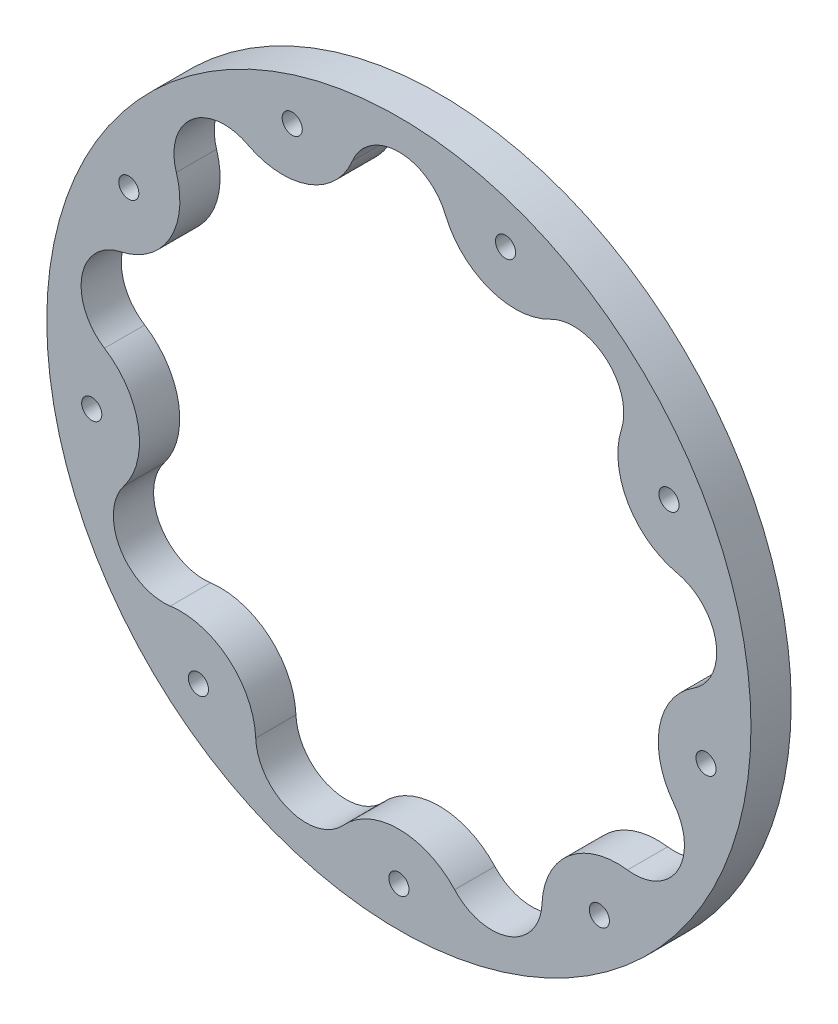
ISO-10303-21;
HEADER;
FILE_DESCRIPTION(('STEP AP214'),'2;1');
FILE_NAME('part.step','',(''),(''),'','','');
FILE_SCHEMA(('AUTOMOTIVE_DESIGN { 1 0 10303 214 1 1 1 1 }'));
ENDSEC;
DATA;
#1=APPLICATION_CONTEXT('core data for automotive mechanical design processes');
#2=APPLICATION_PROTOCOL_DEFINITION('international standard','automotive_design',2000,#1);
#3=PRODUCT_CONTEXT('',#1,'mechanical');
#4=PRODUCT('Part','Part','',(#3));
#5=PRODUCT_RELATED_PRODUCT_CATEGORY('part','',(#4));
#6=PRODUCT_DEFINITION_FORMATION('','',#4);
#7=PRODUCT_DEFINITION_CONTEXT('part definition',#1,'design');
#8=PRODUCT_DEFINITION('design','',#6,#7);
#9=PRODUCT_DEFINITION_SHAPE('','',#8);
#10=(LENGTH_UNIT() NAMED_UNIT(*) SI_UNIT(.MILLI.,.METRE.));
#11=(NAMED_UNIT(*) PLANE_ANGLE_UNIT() SI_UNIT($,.RADIAN.));
#12=(NAMED_UNIT(*) SI_UNIT($,.STERADIAN.) SOLID_ANGLE_UNIT());
#13=UNCERTAINTY_MEASURE_WITH_UNIT(LENGTH_MEASURE(1.E-05),#10,'distance_accuracy_value','');
#14=(GEOMETRIC_REPRESENTATION_CONTEXT(3) GLOBAL_UNCERTAINTY_ASSIGNED_CONTEXT((#13)) GLOBAL_UNIT_ASSIGNED_CONTEXT((#10,
#11,#12)) REPRESENTATION_CONTEXT('',''));
#15=CARTESIAN_POINT('',(0.,0.,0.));
#16=DIRECTION('',(0.,0.,1.));
#17=DIRECTION('',(1.,0.,0.));
#18=AXIS2_PLACEMENT_3D('',#15,#16,#17);
#19=CARTESIAN_POINT('',(0.,0.,8.));
#20=DIRECTION('',(0.,0.,-1.));
#21=DIRECTION('',(-1.,0.,0.));
#22=AXIS2_PLACEMENT_3D('',#19,#20,#21);
#23=CYLINDRICAL_SURFACE('',#22,70.);
#24=CARTESIAN_POINT('',(0.,0.,8.));
#25=DIRECTION('',(0.,0.,1.));
#26=DIRECTION('',(1.,0.,0.));
#27=AXIS2_PLACEMENT_3D('',#24,#25,#26);
#28=CIRCLE('',#27,70.);
#29=CARTESIAN_POINT('',(70.,0.,8.));
#30=VERTEX_POINT('',#29);
#31=EDGE_CURVE('E11',#30,#30,#28,.T.);
#32=ORIENTED_EDGE('',*,*,#31,.F.);
#33=EDGE_LOOP('',(#32));
#34=FACE_BOUND('',#33,.T.);
#35=CARTESIAN_POINT('',(0.,0.,0.));
#36=DIRECTION('',(0.,0.,1.));
#37=DIRECTION('',(1.,0.,0.));
#38=AXIS2_PLACEMENT_3D('',#35,#36,#37);
#39=CIRCLE('',#38,70.);
#40=CARTESIAN_POINT('',(70.,0.,0.));
#41=VERTEX_POINT('',#40);
#42=EDGE_CURVE('E44',#41,#41,#39,.T.);
#43=ORIENTED_EDGE('',*,*,#42,.T.);
#44=EDGE_LOOP('',(#43));
#45=FACE_BOUND('',#44,.T.);
#46=ADVANCED_FACE('F41',(#34,#45),#23,.T.);
#47=CARTESIAN_POINT('',(0.,0.,8.));
#48=DIRECTION('',(0.,0.,1.));
#49=DIRECTION('',(1.,0.,0.));
#50=AXIS2_PLACEMENT_3D('',#47,#48,#49);
#51=PLANE('',#50);
#52=CARTESIAN_POINT('',(21.2052488861907,58.2609424887266,8.));
#53=DIRECTION('',(0.,0.,-1.));
#54=DIRECTION('',(-1.,0.,0.));
#55=AXIS2_PLACEMENT_3D('',#52,#53,#54);
#56=CIRCLE('',#55,1.99999999999999);
#57=CARTESIAN_POINT('',(19.2052488861907,58.2609424887266,8.));
#58=VERTEX_POINT('',#57);
#59=EDGE_CURVE('E647',#58,#58,#56,.T.);
#60=ORIENTED_EDGE('',*,*,#59,.T.);
#61=EDGE_LOOP('',(#60));
#62=FACE_BOUND('',#61,.T.);
#63=CARTESIAN_POINT('',(53.6935750346349,31.0000000000006,8.));
#64=DIRECTION('',(0.,0.,-1.));
#65=DIRECTION('',(-1.,0.,0.));
#66=AXIS2_PLACEMENT_3D('',#63,#64,#65);
#67=CIRCLE('',#66,2.);
#68=CARTESIAN_POINT('',(51.6935750346349,31.0000000000006,8.));
#69=VERTEX_POINT('',#68);
#70=EDGE_CURVE('E650',#69,#69,#67,.T.);
#71=ORIENTED_EDGE('',*,*,#70,.T.);
#72=EDGE_LOOP('',(#71));
#73=FACE_BOUND('',#72,.T.);
#74=CARTESIAN_POINT('',(61.058080686757,-10.7661870153491,8.));
#75=DIRECTION('',(0.,0.,-1.));
#76=DIRECTION('',(-1.,0.,0.));
#77=AXIS2_PLACEMENT_3D('',#74,#75,#76);
#78=CIRCLE('',#77,2.00000000000001);
#79=CARTESIAN_POINT('',(59.058080686757,-10.7661870153491,8.));
#80=VERTEX_POINT('',#79);
#81=EDGE_CURVE('E699',#80,#80,#78,.T.);
#82=ORIENTED_EDGE('',*,*,#81,.T.);
#83=EDGE_LOOP('',(#82));
#84=FACE_BOUND('',#83,.T.);
#85=CARTESIAN_POINT('',(39.8528318005658,-47.4947554733763,8.));
#86=DIRECTION('',(0.,0.,-1.));
#87=DIRECTION('',(-1.,0.,0.));
#88=AXIS2_PLACEMENT_3D('',#85,#86,#87);
#89=CIRCLE('',#88,2.);
#90=CARTESIAN_POINT('',(37.8528318005658,-47.4947554733763,8.));
#91=VERTEX_POINT('',#90);
#92=EDGE_CURVE('E693',#91,#91,#89,.T.);
#93=ORIENTED_EDGE('',*,*,#92,.T.);
#94=EDGE_LOOP('',(#93));
#95=FACE_BOUND('',#94,.T.);
#96=CARTESIAN_POINT('',(4.26741975090295E-13,-62.,8.));
#97=DIRECTION('',(0.,0.,-1.));
#98=DIRECTION('',(-1.,0.,0.));
#99=AXIS2_PLACEMENT_3D('',#96,#97,#98);
#100=CIRCLE('',#99,2.);
#101=CARTESIAN_POINT('',(-1.99999999999958,-62.,8.));
#102=VERTEX_POINT('',#101);
#103=EDGE_CURVE('E687',#102,#102,#100,.T.);
#104=ORIENTED_EDGE('',*,*,#103,.T.);
#105=EDGE_LOOP('',(#104));
#106=FACE_BOUND('',#105,.T.);
#107=CARTESIAN_POINT('',(-39.8528318005652,-47.4947554733769,8.));
#108=DIRECTION('',(0.,0.,-1.));
#109=DIRECTION('',(-1.,0.,0.));
#110=AXIS2_PLACEMENT_3D('',#107,#108,#109);
#111=CIRCLE('',#110,2.00000000000001);
#112=CARTESIAN_POINT('',(-41.8528318005652,-47.4947554733769,8.));
#113=VERTEX_POINT('',#112);
#114=EDGE_CURVE('E681',#113,#113,#111,.T.);
#115=ORIENTED_EDGE('',*,*,#114,.T.);
#116=EDGE_LOOP('',(#115));
#117=FACE_BOUND('',#116,.T.);
#118=CARTESIAN_POINT('',(-61.0580806867568,-10.7661870153499,8.));
#119=DIRECTION('',(0.,0.,-1.));
#120=DIRECTION('',(-1.,0.,0.));
#121=AXIS2_PLACEMENT_3D('',#118,#119,#120);
#122=CIRCLE('',#121,2.);
#123=CARTESIAN_POINT('',(-63.0580806867568,-10.7661870153499,8.));
#124=VERTEX_POINT('',#123);
#125=EDGE_CURVE('E675',#124,#124,#122,.T.);
#126=ORIENTED_EDGE('',*,*,#125,.T.);
#127=EDGE_LOOP('',(#126));
#128=FACE_BOUND('',#127,.T.);
#129=CARTESIAN_POINT('',(-53.6935750346353,30.9999999999999,8.));
#130=DIRECTION('',(0.,0.,-1.));
#131=DIRECTION('',(-1.,0.,0.));
#132=AXIS2_PLACEMENT_3D('',#129,#130,#131);
#133=CIRCLE('',#132,2.);
#134=CARTESIAN_POINT('',(-55.6935750346353,30.9999999999999,8.));
#135=VERTEX_POINT('',#134);
#136=EDGE_CURVE('E665',#135,#135,#133,.T.);
#137=ORIENTED_EDGE('',*,*,#136,.T.);
#138=EDGE_LOOP('',(#137));
#139=FACE_BOUND('',#138,.T.);
#140=CARTESIAN_POINT('',(-21.2052488861915,58.2609424887263,8.));
#141=DIRECTION('',(0.,0.,-1.));
#142=DIRECTION('',(-1.,0.,0.));
#143=AXIS2_PLACEMENT_3D('',#140,#141,#142);
#144=CIRCLE('',#143,2.);
#145=CARTESIAN_POINT('',(-23.2052488861915,58.2609424887263,8.));
#146=VERTEX_POINT('',#145);
#147=EDGE_CURVE('E238',#146,#146,#144,.T.);
#148=ORIENTED_EDGE('',*,*,#147,.T.);
#149=EDGE_LOOP('',(#148));
#150=FACE_BOUND('',#149,.T.);
#151=CARTESIAN_POINT('',(-23.1180034247961,63.5161923925021,8.));
#152=DIRECTION('',(0.,0.,-1.));
#153=DIRECTION('',(1.,0.,0.));
#154=AXIS2_PLACEMENT_3D('',#151,#152,#153);
#155=CIRCLE('',#154,15.);
#156=CARTESIAN_POINT('',(-9.2472013699185,57.8064769570008,8.));
#157=VERTEX_POINT('',#156);
#158=CARTESIAN_POINT('',(-30.0735199237625,50.2263169140555,8.));
#159=VERTEX_POINT('',#158);
#160=EDGE_CURVE('E55',#157,#159,#155,.T.);
#161=ORIENTED_EDGE('',*,*,#160,.F.);
#162=CARTESIAN_POINT('',(0.,54.,8.));
#163=DIRECTION('',(0.,0.,1.));
#164=DIRECTION('',(1.,0.,0.));
#165=AXIS2_PLACEMENT_3D('',#162,#163,#164);
#166=CIRCLE('',#165,10.);
#167=CARTESIAN_POINT('',(9.24720136991851,57.8064769570008,8.));
#168=VERTEX_POINT('',#167);
#169=EDGE_CURVE('E184',#168,#157,#166,.T.);
#170=ORIENTED_EDGE('',*,*,#169,.F.);
#171=CARTESIAN_POINT('',(23.1180034247963,63.516192392502,8.));
#172=DIRECTION('',(0.,0.,-1.));
#173=DIRECTION('',(1.,0.,0.));
#174=AXIS2_PLACEMENT_3D('',#171,#172,#173);
#175=CIRCLE('',#174,15.);
#176=CARTESIAN_POINT('',(30.0735199237624,50.2263169140557,8.));
#177=VERTEX_POINT('',#176);
#178=EDGE_CURVE('E187',#177,#168,#175,.T.);
#179=ORIENTED_EDGE('',*,*,#178,.F.);
#180=CARTESIAN_POINT('',(34.7105309230731,41.3663999284248,8.));
#181=DIRECTION('',(0.,0.,1.));
#182=DIRECTION('',(1.,0.,0.));
#183=AXIS2_PLACEMENT_3D('',#180,#181,#182);
#184=CIRCLE('',#183,10.);
#185=CARTESIAN_POINT('',(44.2410543714188,38.3383439843357,8.));
#186=VERTEX_POINT('',#185);
#187=EDGE_CURVE('E279',#186,#177,#184,.T.);
#188=ORIENTED_EDGE('',*,*,#187,.F.);
#189=CARTESIAN_POINT('',(58.5368395439375,33.796260068202,8.));
#190=DIRECTION('',(0.,0.,-1.));
#191=DIRECTION('',(1.,0.,0.));
#192=AXIS2_PLACEMENT_3D('',#189,#190,#191);
#193=CIRCLE('',#192,15.);
#194=CARTESIAN_POINT('',(55.3225070151705,19.1447049836892,8.));
#195=VERTEX_POINT('',#194);
#196=EDGE_CURVE('E276',#195,#186,#193,.T.);
#197=ORIENTED_EDGE('',*,*,#196,.F.);
#198=CARTESIAN_POINT('',(53.1796186626592,9.37700159401424,8.));
#199=DIRECTION('',(0.,0.,1.));
#200=DIRECTION('',(1.,0.,0.));
#201=AXIS2_PLACEMENT_3D('',#198,#199,#200);
#202=CIRCLE('',#201,10.0000000000001);
#203=CARTESIAN_POINT('',(58.5340263479814,0.931273778167683,8.));
#204=VERTEX_POINT('',#203);
#205=EDGE_CURVE('E273',#204,#195,#202,.T.);
#206=ORIENTED_EDGE('',*,*,#205,.F.);
#207=CARTESIAN_POINT('',(66.5656378759647,-11.7373179456022,8.));
#208=DIRECTION('',(0.,0.,-1.));
#209=DIRECTION('',(1.,0.,0.));
#210=AXIS2_PLACEMENT_3D('',#207,#208,#209);
#211=CIRCLE('',#210,15.);
#212=CARTESIAN_POINT('',(54.6854782330016,-20.894927178241,8.));
#213=VERTEX_POINT('',#212);
#214=EDGE_CURVE('E270',#213,#204,#211,.T.);
#215=ORIENTED_EDGE('',*,*,#214,.F.);
#216=CARTESIAN_POINT('',(46.7653718043597,-27.,8.));
#217=DIRECTION('',(0.,0.,1.));
#218=DIRECTION('',(1.,0.,0.));
#219=AXIS2_PLACEMENT_3D('',#216,#217,#218);
#220=CIRCLE('',#219,10.0000000000001);
#221=CARTESIAN_POINT('',(45.4382768630831,-36.9115497787601,8.));
#222=VERTEX_POINT('',#221);
#223=EDGE_CURVE('E267',#222,#213,#220,.T.);
#224=ORIENTED_EDGE('',*,*,#223,.F.);
#225=CARTESIAN_POINT('',(43.4476344511683,-51.7788744469004,8.));
#226=DIRECTION('',(0.,0.,-1.));
#227=DIRECTION('',(1.,0.,0.));
#228=AXIS2_PLACEMENT_3D('',#225,#226,#227);
#229=CIRCLE('',#228,15.);
#230=CARTESIAN_POINT('',(28.4605064242188,-51.1575906922237,8.));
#231=VERTEX_POINT('',#230);
#232=EDGE_CURVE('E264',#231,#222,#229,.T.);
#233=ORIENTED_EDGE('',*,*,#232,.F.);
#234=CARTESIAN_POINT('',(18.4690877395861,-50.7434015224391,8.));
#235=DIRECTION('',(0.,0.,1.));
#236=DIRECTION('',(1.,0.,0.));
#237=AXIS2_PLACEMENT_3D('',#234,#235,#236);
#238=CIRCLE('',#237,10.);
#239=CARTESIAN_POINT('',(11.0814526437515,-57.483048968025,8.));
#240=VERTEX_POINT('',#239);
#241=EDGE_CURVE('E261',#240,#231,#238,.T.);
#242=ORIENTED_EDGE('',*,*,#241,.F.);
#243=CARTESIAN_POINT('',(-5.18682319317065E-13,-67.5925201364043,8.));
#244=DIRECTION('',(0.,0.,-1.));
#245=DIRECTION('',(1.,0.,0.));
#246=AXIS2_PLACEMENT_3D('',#243,#244,#245);
#247=CIRCLE('',#246,15.);
#248=CARTESIAN_POINT('',(-11.0814526437521,-57.4830489680251,8.));
#249=VERTEX_POINT('',#248);
#250=EDGE_CURVE('E258',#249,#240,#247,.T.);
#251=ORIENTED_EDGE('',*,*,#250,.F.);
#252=CARTESIAN_POINT('',(-18.4690877395861,-50.7434015224391,8.));
#253=DIRECTION('',(0.,0.,1.));
#254=DIRECTION('',(1.,0.,0.));
#255=AXIS2_PLACEMENT_3D('',#252,#253,#254);
#256=CIRCLE('',#255,10.);
#257=CARTESIAN_POINT('',(-28.4605064242192,-51.1575906922232,8.));
#258=VERTEX_POINT('',#257);
#259=EDGE_CURVE('E255',#258,#249,#256,.T.);
#260=ORIENTED_EDGE('',*,*,#259,.F.);
#261=CARTESIAN_POINT('',(-43.4476344511691,-51.7788744468997,8.));
#262=DIRECTION('',(0.,0.,-1.));
#263=DIRECTION('',(1.,0.,0.));
#264=AXIS2_PLACEMENT_3D('',#261,#262,#263);
#265=CIRCLE('',#264,15.);
#266=CARTESIAN_POINT('',(-45.4382768630836,-36.9115497787596,8.));
#267=VERTEX_POINT('',#266);
#268=EDGE_CURVE('E252',#267,#258,#265,.T.);
#269=ORIENTED_EDGE('',*,*,#268,.F.);
#270=CARTESIAN_POINT('',(-46.7653718043597,-27.,8.));
#271=DIRECTION('',(0.,0.,1.));
#272=DIRECTION('',(1.,0.,0.));
#273=AXIS2_PLACEMENT_3D('',#270,#271,#272);
#274=CIRCLE('',#273,10.);
#275=CARTESIAN_POINT('',(-54.6854782330015,-20.8949271782405,8.));
#276=VERTEX_POINT('',#275);
#277=EDGE_CURVE('E249',#276,#267,#274,.T.);
#278=ORIENTED_EDGE('',*,*,#277,.F.);
#279=CARTESIAN_POINT('',(-66.5656378759649,-11.7373179456012,8.));
#280=DIRECTION('',(0.,0.,-1.));
#281=DIRECTION('',(1.,0.,0.));
#282=AXIS2_PLACEMENT_3D('',#279,#280,#281);
#283=CIRCLE('',#282,15.);
#284=CARTESIAN_POINT('',(-58.5340263479814,0.93127377816838,8.));
#285=VERTEX_POINT('',#284);
#286=EDGE_CURVE('E246',#285,#276,#283,.T.);
#287=ORIENTED_EDGE('',*,*,#286,.F.);
#288=CARTESIAN_POINT('',(-53.1796186626592,9.37700159401422,8.));
#289=DIRECTION('',(0.,0.,1.));
#290=DIRECTION('',(1.,0.,0.));
#291=AXIS2_PLACEMENT_3D('',#288,#289,#290);
#292=CIRCLE('',#291,10.0000000000001);
#293=CARTESIAN_POINT('',(-55.3225070151701,19.1447049836895,8.));
#294=VERTEX_POINT('',#293);
#295=EDGE_CURVE('E243',#294,#285,#292,.T.);
#296=ORIENTED_EDGE('',*,*,#295,.F.);
#297=CARTESIAN_POINT('',(-58.5368395439369,33.7962600682029,8.));
#298=DIRECTION('',(0.,0.,-1.));
#299=DIRECTION('',(1.,0.,0.));
#300=AXIS2_PLACEMENT_3D('',#297,#298,#299);
#301=CIRCLE('',#300,15.);
#302=CARTESIAN_POINT('',(-44.2410543714184,38.3383439843363,8.));
#303=VERTEX_POINT('',#302);
#304=EDGE_CURVE('E240',#303,#294,#301,.T.);
#305=ORIENTED_EDGE('',*,*,#304,.F.);
#306=CARTESIAN_POINT('',(-34.7105309230731,41.3663999284248,8.));
#307=DIRECTION('',(0.,0.,1.));
#308=DIRECTION('',(1.,0.,0.));
#309=AXIS2_PLACEMENT_3D('',#306,#307,#308);
#310=CIRCLE('',#309,9.99999999999971);
#311=EDGE_CURVE('E237',#159,#303,#310,.T.);
#312=ORIENTED_EDGE('',*,*,#311,.F.);
#313=EDGE_LOOP('',(#161,#170,#179,#188,#197,#206,#215,#224,#233,#242,#251,#260,#269,#278,#287,
#296,#305,#312));
#314=FACE_BOUND('',#313,.T.);
#315=ORIENTED_EDGE('',*,*,#31,.T.);
#316=EDGE_LOOP('',(#315));
#317=FACE_BOUND('',#316,.T.);
#318=ADVANCED_FACE('F320',(#62,#73,#84,#95,#106,#117,#128,#139,#150,#314,#317),#51,.T.);
#319=CARTESIAN_POINT('',(0.,0.,0.));
#320=DIRECTION('',(0.,0.,1.));
#321=DIRECTION('',(1.,0.,0.));
#322=AXIS2_PLACEMENT_3D('',#319,#320,#321);
#323=PLANE('',#322);
#324=CARTESIAN_POINT('',(21.2052488861907,58.2609424887266,0.));
#325=DIRECTION('',(0.,0.,-1.));
#326=DIRECTION('',(-1.,0.,0.));
#327=AXIS2_PLACEMENT_3D('',#324,#325,#326);
#328=CIRCLE('',#327,1.99999999999999);
#329=CARTESIAN_POINT('',(19.2052488861907,58.2609424887266,0.));
#330=VERTEX_POINT('',#329);
#331=EDGE_CURVE('E649',#330,#330,#328,.T.);
#332=ORIENTED_EDGE('',*,*,#331,.F.);
#333=EDGE_LOOP('',(#332));
#334=FACE_BOUND('',#333,.T.);
#335=CARTESIAN_POINT('',(53.6935750346349,31.0000000000006,0.));
#336=DIRECTION('',(0.,0.,-1.));
#337=DIRECTION('',(-1.,0.,0.));
#338=AXIS2_PLACEMENT_3D('',#335,#336,#337);
#339=CIRCLE('',#338,2.);
#340=CARTESIAN_POINT('',(51.6935750346349,31.0000000000006,0.));
#341=VERTEX_POINT('',#340);
#342=EDGE_CURVE('E653',#341,#341,#339,.T.);
#343=ORIENTED_EDGE('',*,*,#342,.F.);
#344=EDGE_LOOP('',(#343));
#345=FACE_BOUND('',#344,.T.);
#346=CARTESIAN_POINT('',(61.058080686757,-10.7661870153491,0.));
#347=DIRECTION('',(0.,0.,-1.));
#348=DIRECTION('',(-1.,0.,0.));
#349=AXIS2_PLACEMENT_3D('',#346,#347,#348);
#350=CIRCLE('',#349,2.00000000000001);
#351=CARTESIAN_POINT('',(59.058080686757,-10.7661870153491,0.));
#352=VERTEX_POINT('',#351);
#353=EDGE_CURVE('E696',#352,#352,#350,.T.);
#354=ORIENTED_EDGE('',*,*,#353,.F.);
#355=EDGE_LOOP('',(#354));
#356=FACE_BOUND('',#355,.T.);
#357=CARTESIAN_POINT('',(39.8528318005658,-47.4947554733763,0.));
#358=DIRECTION('',(0.,0.,-1.));
#359=DIRECTION('',(-1.,0.,0.));
#360=AXIS2_PLACEMENT_3D('',#357,#358,#359);
#361=CIRCLE('',#360,2.);
#362=CARTESIAN_POINT('',(37.8528318005658,-47.4947554733763,0.));
#363=VERTEX_POINT('',#362);
#364=EDGE_CURVE('E690',#363,#363,#361,.T.);
#365=ORIENTED_EDGE('',*,*,#364,.F.);
#366=EDGE_LOOP('',(#365));
#367=FACE_BOUND('',#366,.T.);
#368=CARTESIAN_POINT('',(4.26741975090295E-13,-62.,0.));
#369=DIRECTION('',(0.,0.,-1.));
#370=DIRECTION('',(-1.,0.,0.));
#371=AXIS2_PLACEMENT_3D('',#368,#369,#370);
#372=CIRCLE('',#371,2.);
#373=CARTESIAN_POINT('',(-1.99999999999958,-62.,0.));
#374=VERTEX_POINT('',#373);
#375=EDGE_CURVE('E684',#374,#374,#372,.T.);
#376=ORIENTED_EDGE('',*,*,#375,.F.);
#377=EDGE_LOOP('',(#376));
#378=FACE_BOUND('',#377,.T.);
#379=CARTESIAN_POINT('',(-39.8528318005652,-47.4947554733769,0.));
#380=DIRECTION('',(0.,0.,-1.));
#381=DIRECTION('',(-1.,0.,0.));
#382=AXIS2_PLACEMENT_3D('',#379,#380,#381);
#383=CIRCLE('',#382,2.00000000000001);
#384=CARTESIAN_POINT('',(-41.8528318005652,-47.4947554733769,0.));
#385=VERTEX_POINT('',#384);
#386=EDGE_CURVE('E678',#385,#385,#383,.T.);
#387=ORIENTED_EDGE('',*,*,#386,.F.);
#388=EDGE_LOOP('',(#387));
#389=FACE_BOUND('',#388,.T.);
#390=CARTESIAN_POINT('',(-61.0580806867568,-10.7661870153499,0.));
#391=DIRECTION('',(0.,0.,-1.));
#392=DIRECTION('',(-1.,0.,0.));
#393=AXIS2_PLACEMENT_3D('',#390,#391,#392);
#394=CIRCLE('',#393,2.);
#395=CARTESIAN_POINT('',(-63.0580806867568,-10.7661870153499,0.));
#396=VERTEX_POINT('',#395);
#397=EDGE_CURVE('E670',#396,#396,#394,.T.);
#398=ORIENTED_EDGE('',*,*,#397,.F.);
#399=EDGE_LOOP('',(#398));
#400=FACE_BOUND('',#399,.T.);
#401=CARTESIAN_POINT('',(-53.6935750346353,30.9999999999999,0.));
#402=DIRECTION('',(0.,0.,-1.));
#403=DIRECTION('',(-1.,0.,0.));
#404=AXIS2_PLACEMENT_3D('',#401,#402,#403);
#405=CIRCLE('',#404,2.);
#406=CARTESIAN_POINT('',(-55.6935750346353,30.9999999999999,0.));
#407=VERTEX_POINT('',#406);
#408=EDGE_CURVE('E661',#407,#407,#405,.T.);
#409=ORIENTED_EDGE('',*,*,#408,.F.);
#410=EDGE_LOOP('',(#409));
#411=FACE_BOUND('',#410,.T.);
#412=CARTESIAN_POINT('',(-21.2052488861915,58.2609424887263,0.));
#413=DIRECTION('',(0.,0.,-1.));
#414=DIRECTION('',(-1.,0.,0.));
#415=AXIS2_PLACEMENT_3D('',#412,#413,#414);
#416=CIRCLE('',#415,2.);
#417=CARTESIAN_POINT('',(-23.2052488861915,58.2609424887263,0.));
#418=VERTEX_POINT('',#417);
#419=EDGE_CURVE('E190',#418,#418,#416,.T.);
#420=ORIENTED_EDGE('',*,*,#419,.F.);
#421=EDGE_LOOP('',(#420));
#422=FACE_BOUND('',#421,.T.);
#423=CARTESIAN_POINT('',(0.,54.,0.));
#424=DIRECTION('',(0.,0.,1.));
#425=DIRECTION('',(1.,0.,0.));
#426=AXIS2_PLACEMENT_3D('',#423,#424,#425);
#427=CIRCLE('',#426,10.);
#428=CARTESIAN_POINT('',(9.24720136991851,57.8064769570008,0.));
#429=VERTEX_POINT('',#428);
#430=CARTESIAN_POINT('',(-9.2472013699185,57.8064769570008,0.));
#431=VERTEX_POINT('',#430);
#432=EDGE_CURVE('E173',#429,#431,#427,.T.);
#433=ORIENTED_EDGE('',*,*,#432,.T.);
#434=CARTESIAN_POINT('',(-23.1180034247961,63.5161923925021,0.));
#435=DIRECTION('',(0.,0.,-1.));
#436=DIRECTION('',(1.,0.,0.));
#437=AXIS2_PLACEMENT_3D('',#434,#435,#436);
#438=CIRCLE('',#437,15.);
#439=CARTESIAN_POINT('',(-30.0735199237625,50.2263169140555,0.));
#440=VERTEX_POINT('',#439);
#441=EDGE_CURVE('E167',#431,#440,#438,.T.);
#442=ORIENTED_EDGE('',*,*,#441,.T.);
#443=CARTESIAN_POINT('',(-34.7105309230731,41.3663999284248,0.));
#444=DIRECTION('',(0.,0.,1.));
#445=DIRECTION('',(1.,0.,0.));
#446=AXIS2_PLACEMENT_3D('',#443,#444,#445);
#447=CIRCLE('',#446,9.99999999999971);
#448=CARTESIAN_POINT('',(-44.2410543714186,38.3383439843362,0.));
#449=VERTEX_POINT('',#448);
#450=EDGE_CURVE('E176',#440,#449,#447,.T.);
#451=ORIENTED_EDGE('',*,*,#450,.T.);
#452=CARTESIAN_POINT('',(-58.5368395439369,33.7962600682029,0.));
#453=DIRECTION('',(0.,0.,-1.));
#454=DIRECTION('',(1.,0.,0.));
#455=AXIS2_PLACEMENT_3D('',#452,#453,#454);
#456=CIRCLE('',#455,15.);
#457=CARTESIAN_POINT('',(-55.3225070151701,19.1447049836895,0.));
#458=VERTEX_POINT('',#457);
#459=EDGE_CURVE('E63',#449,#458,#456,.T.);
#460=ORIENTED_EDGE('',*,*,#459,.T.);
#461=CARTESIAN_POINT('',(-53.1796186626592,9.37700159401422,0.));
#462=DIRECTION('',(0.,0.,1.));
#463=DIRECTION('',(1.,0.,0.));
#464=AXIS2_PLACEMENT_3D('',#461,#462,#463);
#465=CIRCLE('',#464,10.0000000000001);
#466=CARTESIAN_POINT('',(-58.5340263479814,0.93127377816838,0.));
#467=VERTEX_POINT('',#466);
#468=EDGE_CURVE('E194',#458,#467,#465,.T.);
#469=ORIENTED_EDGE('',*,*,#468,.T.);
#470=CARTESIAN_POINT('',(-66.5656378759649,-11.7373179456012,0.));
#471=DIRECTION('',(0.,0.,-1.));
#472=DIRECTION('',(1.,0.,0.));
#473=AXIS2_PLACEMENT_3D('',#470,#471,#472);
#474=CIRCLE('',#473,15.);
#475=CARTESIAN_POINT('',(-54.6854782330015,-20.8949271782405,0.));
#476=VERTEX_POINT('',#475);
#477=EDGE_CURVE('E197',#467,#476,#474,.T.);
#478=ORIENTED_EDGE('',*,*,#477,.T.);
#479=CARTESIAN_POINT('',(-46.7653718043597,-27.,0.));
#480=DIRECTION('',(0.,0.,1.));
#481=DIRECTION('',(1.,0.,0.));
#482=AXIS2_PLACEMENT_3D('',#479,#480,#481);
#483=CIRCLE('',#482,10.);
#484=CARTESIAN_POINT('',(-45.4382768630836,-36.9115497787596,0.));
#485=VERTEX_POINT('',#484);
#486=EDGE_CURVE('E200',#476,#485,#483,.T.);
#487=ORIENTED_EDGE('',*,*,#486,.T.);
#488=CARTESIAN_POINT('',(-43.4476344511691,-51.7788744468997,0.));
#489=DIRECTION('',(0.,0.,-1.));
#490=DIRECTION('',(1.,0.,0.));
#491=AXIS2_PLACEMENT_3D('',#488,#489,#490);
#492=CIRCLE('',#491,15.);
#493=CARTESIAN_POINT('',(-28.4605064242192,-51.1575906922232,0.));
#494=VERTEX_POINT('',#493);
#495=EDGE_CURVE('E203',#485,#494,#492,.T.);
#496=ORIENTED_EDGE('',*,*,#495,.T.);
#497=CARTESIAN_POINT('',(-18.4690877395861,-50.7434015224391,0.));
#498=DIRECTION('',(0.,0.,1.));
#499=DIRECTION('',(1.,0.,0.));
#500=AXIS2_PLACEMENT_3D('',#497,#498,#499);
#501=CIRCLE('',#500,10.);
#502=CARTESIAN_POINT('',(-11.0814526437521,-57.4830489680251,0.));
#503=VERTEX_POINT('',#502);
#504=EDGE_CURVE('E206',#494,#503,#501,.T.);
#505=ORIENTED_EDGE('',*,*,#504,.T.);
#506=CARTESIAN_POINT('',(-5.18682319317065E-13,-67.5925201364043,0.));
#507=DIRECTION('',(0.,0.,-1.));
#508=DIRECTION('',(1.,0.,0.));
#509=AXIS2_PLACEMENT_3D('',#506,#507,#508);
#510=CIRCLE('',#509,15.);
#511=CARTESIAN_POINT('',(11.0814526437515,-57.483048968025,0.));
#512=VERTEX_POINT('',#511);
#513=EDGE_CURVE('E209',#503,#512,#510,.T.);
#514=ORIENTED_EDGE('',*,*,#513,.T.);
#515=CARTESIAN_POINT('',(18.4690877395861,-50.7434015224391,0.));
#516=DIRECTION('',(0.,0.,1.));
#517=DIRECTION('',(1.,0.,0.));
#518=AXIS2_PLACEMENT_3D('',#515,#516,#517);
#519=CIRCLE('',#518,10.);
#520=CARTESIAN_POINT('',(28.4605064242188,-51.1575906922237,0.));
#521=VERTEX_POINT('',#520);
#522=EDGE_CURVE('E212',#512,#521,#519,.T.);
#523=ORIENTED_EDGE('',*,*,#522,.T.);
#524=CARTESIAN_POINT('',(43.4476344511683,-51.7788744469004,0.));
#525=DIRECTION('',(0.,0.,-1.));
#526=DIRECTION('',(1.,0.,0.));
#527=AXIS2_PLACEMENT_3D('',#524,#525,#526);
#528=CIRCLE('',#527,15.);
#529=CARTESIAN_POINT('',(45.4382768630831,-36.9115497787601,0.));
#530=VERTEX_POINT('',#529);
#531=EDGE_CURVE('E215',#521,#530,#528,.T.);
#532=ORIENTED_EDGE('',*,*,#531,.T.);
#533=CARTESIAN_POINT('',(46.7653718043597,-27.,0.));
#534=DIRECTION('',(0.,0.,1.));
#535=DIRECTION('',(1.,0.,0.));
#536=AXIS2_PLACEMENT_3D('',#533,#534,#535);
#537=CIRCLE('',#536,10.0000000000001);
#538=CARTESIAN_POINT('',(54.6854782330016,-20.894927178241,0.));
#539=VERTEX_POINT('',#538);
#540=EDGE_CURVE('E218',#530,#539,#537,.T.);
#541=ORIENTED_EDGE('',*,*,#540,.T.);
#542=CARTESIAN_POINT('',(66.5656378759647,-11.7373179456022,0.));
#543=DIRECTION('',(0.,0.,-1.));
#544=DIRECTION('',(1.,0.,0.));
#545=AXIS2_PLACEMENT_3D('',#542,#543,#544);
#546=CIRCLE('',#545,15.);
#547=CARTESIAN_POINT('',(58.5340263479814,0.931273778167683,0.));
#548=VERTEX_POINT('',#547);
#549=EDGE_CURVE('E221',#539,#548,#546,.T.);
#550=ORIENTED_EDGE('',*,*,#549,.T.);
#551=CARTESIAN_POINT('',(53.1796186626592,9.37700159401424,0.));
#552=DIRECTION('',(0.,0.,1.));
#553=DIRECTION('',(1.,0.,0.));
#554=AXIS2_PLACEMENT_3D('',#551,#552,#553);
#555=CIRCLE('',#554,10.0000000000001);
#556=CARTESIAN_POINT('',(55.3225070151705,19.1447049836892,0.));
#557=VERTEX_POINT('',#556);
#558=EDGE_CURVE('E224',#548,#557,#555,.T.);
#559=ORIENTED_EDGE('',*,*,#558,.T.);
#560=CARTESIAN_POINT('',(58.5368395439375,33.796260068202,0.));
#561=DIRECTION('',(0.,0.,-1.));
#562=DIRECTION('',(1.,0.,0.));
#563=AXIS2_PLACEMENT_3D('',#560,#561,#562);
#564=CIRCLE('',#563,15.);
#565=CARTESIAN_POINT('',(44.2410543714188,38.3383439843357,0.));
#566=VERTEX_POINT('',#565);
#567=EDGE_CURVE('E227',#557,#566,#564,.T.);
#568=ORIENTED_EDGE('',*,*,#567,.T.);
#569=CARTESIAN_POINT('',(34.7105309230731,41.3663999284248,0.));
#570=DIRECTION('',(0.,0.,1.));
#571=DIRECTION('',(1.,0.,0.));
#572=AXIS2_PLACEMENT_3D('',#569,#570,#571);
#573=CIRCLE('',#572,10.);
#574=CARTESIAN_POINT('',(30.0735199237624,50.2263169140557,0.));
#575=VERTEX_POINT('',#574);
#576=EDGE_CURVE('E230',#566,#575,#573,.T.);
#577=ORIENTED_EDGE('',*,*,#576,.T.);
#578=CARTESIAN_POINT('',(23.1180034247963,63.516192392502,0.));
#579=DIRECTION('',(0.,0.,-1.));
#580=DIRECTION('',(1.,0.,0.));
#581=AXIS2_PLACEMENT_3D('',#578,#579,#580);
#582=CIRCLE('',#581,15.);
#583=EDGE_CURVE('E233',#575,#429,#582,.T.);
#584=ORIENTED_EDGE('',*,*,#583,.T.);
#585=EDGE_LOOP('',(#433,#442,#451,#460,#469,#478,#487,#496,#505,#514,#523,#532,#541,#550,#559,
#568,#577,#584));
#586=FACE_BOUND('',#585,.T.);
#587=ORIENTED_EDGE('',*,*,#42,.F.);
#588=EDGE_LOOP('',(#587));
#589=FACE_BOUND('',#588,.T.);
#590=ADVANCED_FACE('F180',(#334,#345,#356,#367,#378,#389,#400,#411,#422,#586,#589),#323,.F.);
#591=CARTESIAN_POINT('',(-23.1180034247961,63.5161923925021,0.));
#592=DIRECTION('',(0.,0.,1.));
#593=DIRECTION('',(1.,0.,0.));
#594=AXIS2_PLACEMENT_3D('',#591,#592,#593);
#595=CYLINDRICAL_SURFACE('',#594,15.);
#596=ORIENTED_EDGE('',*,*,#160,.T.);
#597=DIRECTION('',(0.,0.,1.));
#598=VECTOR('',#597,1.);
#599=CARTESIAN_POINT('',(-30.0735199237625,50.2263169140555,0.));
#600=LINE('',#599,#598);
#601=EDGE_CURVE('E163',#440,#159,#600,.T.);
#602=ORIENTED_EDGE('',*,*,#601,.F.);
#603=ORIENTED_EDGE('',*,*,#441,.F.);
#604=DIRECTION('',(0.,0.,1.));
#605=VECTOR('',#604,1.);
#606=CARTESIAN_POINT('',(-9.2472013699185,57.8064769570008,0.));
#607=LINE('',#606,#605);
#608=EDGE_CURVE('E284',#431,#157,#607,.T.);
#609=ORIENTED_EDGE('',*,*,#608,.T.);
#610=EDGE_LOOP('',(#596,#602,#603,#609));
#611=FACE_BOUND('',#610,.T.);
#612=ADVANCED_FACE('F165',(#611),#595,.T.);
#613=CARTESIAN_POINT('',(0.,54.,0.));
#614=DIRECTION('',(0.,0.,1.));
#615=DIRECTION('',(1.,0.,0.));
#616=AXIS2_PLACEMENT_3D('',#613,#614,#615);
#617=CYLINDRICAL_SURFACE('',#616,10.);
#618=ORIENTED_EDGE('',*,*,#169,.T.);
#619=ORIENTED_EDGE('',*,*,#608,.F.);
#620=ORIENTED_EDGE('',*,*,#432,.F.);
#621=DIRECTION('',(0.,0.,1.));
#622=VECTOR('',#621,1.);
#623=CARTESIAN_POINT('',(9.24720136991851,57.8064769570008,0.));
#624=LINE('',#623,#622);
#625=EDGE_CURVE('E286',#429,#168,#624,.T.);
#626=ORIENTED_EDGE('',*,*,#625,.T.);
#627=EDGE_LOOP('',(#618,#619,#620,#626));
#628=FACE_BOUND('',#627,.T.);
#629=ADVANCED_FACE('F379',(#628),#617,.F.);
#630=CARTESIAN_POINT('',(23.1180034247963,63.516192392502,0.));
#631=DIRECTION('',(0.,0.,1.));
#632=DIRECTION('',(1.,0.,0.));
#633=AXIS2_PLACEMENT_3D('',#630,#631,#632);
#634=CYLINDRICAL_SURFACE('',#633,15.);
#635=ORIENTED_EDGE('',*,*,#178,.T.);
#636=ORIENTED_EDGE('',*,*,#625,.F.);
#637=ORIENTED_EDGE('',*,*,#583,.F.);
#638=DIRECTION('',(0.,0.,1.));
#639=VECTOR('',#638,1.);
#640=CARTESIAN_POINT('',(30.0735199237624,50.2263169140557,0.));
#641=LINE('',#640,#639);
#642=EDGE_CURVE('E288',#575,#177,#641,.T.);
#643=ORIENTED_EDGE('',*,*,#642,.T.);
#644=EDGE_LOOP('',(#635,#636,#637,#643));
#645=FACE_BOUND('',#644,.T.);
#646=ADVANCED_FACE('F375',(#645),#634,.T.);
#647=CARTESIAN_POINT('',(34.7105309230731,41.3663999284248,0.));
#648=DIRECTION('',(0.,0.,1.));
#649=DIRECTION('',(1.,0.,0.));
#650=AXIS2_PLACEMENT_3D('',#647,#648,#649);
#651=CYLINDRICAL_SURFACE('',#650,10.);
#652=ORIENTED_EDGE('',*,*,#187,.T.);
#653=ORIENTED_EDGE('',*,*,#642,.F.);
#654=ORIENTED_EDGE('',*,*,#576,.F.);
#655=DIRECTION('',(0.,0.,1.));
#656=VECTOR('',#655,1.);
#657=CARTESIAN_POINT('',(44.2410543714188,38.3383439843357,0.));
#658=LINE('',#657,#656);
#659=EDGE_CURVE('E290',#566,#186,#658,.T.);
#660=ORIENTED_EDGE('',*,*,#659,.T.);
#661=EDGE_LOOP('',(#652,#653,#654,#660));
#662=FACE_BOUND('',#661,.T.);
#663=ADVANCED_FACE('F372',(#662),#651,.F.);
#664=CARTESIAN_POINT('',(58.5368395439375,33.796260068202,0.));
#665=DIRECTION('',(0.,0.,1.));
#666=DIRECTION('',(1.,0.,0.));
#667=AXIS2_PLACEMENT_3D('',#664,#665,#666);
#668=CYLINDRICAL_SURFACE('',#667,15.);
#669=ORIENTED_EDGE('',*,*,#196,.T.);
#670=ORIENTED_EDGE('',*,*,#659,.F.);
#671=ORIENTED_EDGE('',*,*,#567,.F.);
#672=DIRECTION('',(0.,0.,1.));
#673=VECTOR('',#672,1.);
#674=CARTESIAN_POINT('',(55.3225070151705,19.1447049836892,0.));
#675=LINE('',#674,#673);
#676=EDGE_CURVE('E292',#557,#195,#675,.T.);
#677=ORIENTED_EDGE('',*,*,#676,.T.);
#678=EDGE_LOOP('',(#669,#670,#671,#677));
#679=FACE_BOUND('',#678,.T.);
#680=ADVANCED_FACE('F368',(#679),#668,.T.);
#681=CARTESIAN_POINT('',(53.1796186626592,9.37700159401424,0.));
#682=DIRECTION('',(0.,0.,1.));
#683=DIRECTION('',(1.,0.,0.));
#684=AXIS2_PLACEMENT_3D('',#681,#682,#683);
#685=CYLINDRICAL_SURFACE('',#684,10.0000000000001);
#686=ORIENTED_EDGE('',*,*,#205,.T.);
#687=ORIENTED_EDGE('',*,*,#676,.F.);
#688=ORIENTED_EDGE('',*,*,#558,.F.);
#689=DIRECTION('',(0.,0.,1.));
#690=VECTOR('',#689,1.);
#691=CARTESIAN_POINT('',(58.5340263479814,0.931273778167683,0.));
#692=LINE('',#691,#690);
#693=EDGE_CURVE('E294',#548,#204,#692,.T.);
#694=ORIENTED_EDGE('',*,*,#693,.T.);
#695=EDGE_LOOP('',(#686,#687,#688,#694));
#696=FACE_BOUND('',#695,.T.);
#697=ADVANCED_FACE('F364',(#696),#685,.F.);
#698=CARTESIAN_POINT('',(66.5656378759647,-11.7373179456022,0.));
#699=DIRECTION('',(0.,0.,1.));
#700=DIRECTION('',(1.,0.,0.));
#701=AXIS2_PLACEMENT_3D('',#698,#699,#700);
#702=CYLINDRICAL_SURFACE('',#701,15.);
#703=ORIENTED_EDGE('',*,*,#214,.T.);
#704=ORIENTED_EDGE('',*,*,#693,.F.);
#705=ORIENTED_EDGE('',*,*,#549,.F.);
#706=DIRECTION('',(0.,0.,1.));
#707=VECTOR('',#706,1.);
#708=CARTESIAN_POINT('',(54.6854782330016,-20.894927178241,0.));
#709=LINE('',#708,#707);
#710=EDGE_CURVE('E296',#539,#213,#709,.T.);
#711=ORIENTED_EDGE('',*,*,#710,.T.);
#712=EDGE_LOOP('',(#703,#704,#705,#711));
#713=FACE_BOUND('',#712,.T.);
#714=ADVANCED_FACE('F360',(#713),#702,.T.);
#715=CARTESIAN_POINT('',(46.7653718043597,-27.,0.));
#716=DIRECTION('',(0.,0.,1.));
#717=DIRECTION('',(1.,0.,0.));
#718=AXIS2_PLACEMENT_3D('',#715,#716,#717);
#719=CYLINDRICAL_SURFACE('',#718,10.0000000000001);
#720=ORIENTED_EDGE('',*,*,#223,.T.);
#721=ORIENTED_EDGE('',*,*,#710,.F.);
#722=ORIENTED_EDGE('',*,*,#540,.F.);
#723=DIRECTION('',(0.,0.,1.));
#724=VECTOR('',#723,1.);
#725=CARTESIAN_POINT('',(45.4382768630831,-36.9115497787601,0.));
#726=LINE('',#725,#724);
#727=EDGE_CURVE('E298',#530,#222,#726,.T.);
#728=ORIENTED_EDGE('',*,*,#727,.T.);
#729=EDGE_LOOP('',(#720,#721,#722,#728));
#730=FACE_BOUND('',#729,.T.);
#731=ADVANCED_FACE('F356',(#730),#719,.F.);
#732=CARTESIAN_POINT('',(43.4476344511683,-51.7788744469004,0.));
#733=DIRECTION('',(0.,0.,1.));
#734=DIRECTION('',(1.,0.,0.));
#735=AXIS2_PLACEMENT_3D('',#732,#733,#734);
#736=CYLINDRICAL_SURFACE('',#735,15.);
#737=ORIENTED_EDGE('',*,*,#232,.T.);
#738=ORIENTED_EDGE('',*,*,#727,.F.);
#739=ORIENTED_EDGE('',*,*,#531,.F.);
#740=DIRECTION('',(0.,0.,1.));
#741=VECTOR('',#740,1.);
#742=CARTESIAN_POINT('',(28.4605064242188,-51.1575906922237,0.));
#743=LINE('',#742,#741);
#744=EDGE_CURVE('E300',#521,#231,#743,.T.);
#745=ORIENTED_EDGE('',*,*,#744,.T.);
#746=EDGE_LOOP('',(#737,#738,#739,#745));
#747=FACE_BOUND('',#746,.T.);
#748=ADVANCED_FACE('F352',(#747),#736,.T.);
#749=CARTESIAN_POINT('',(18.4690877395861,-50.7434015224391,0.));
#750=DIRECTION('',(0.,0.,1.));
#751=DIRECTION('',(1.,0.,0.));
#752=AXIS2_PLACEMENT_3D('',#749,#750,#751);
#753=CYLINDRICAL_SURFACE('',#752,10.);
#754=ORIENTED_EDGE('',*,*,#241,.T.);
#755=ORIENTED_EDGE('',*,*,#744,.F.);
#756=ORIENTED_EDGE('',*,*,#522,.F.);
#757=DIRECTION('',(0.,0.,1.));
#758=VECTOR('',#757,1.);
#759=CARTESIAN_POINT('',(11.0814526437515,-57.483048968025,0.));
#760=LINE('',#759,#758);
#761=EDGE_CURVE('E302',#512,#240,#760,.T.);
#762=ORIENTED_EDGE('',*,*,#761,.T.);
#763=EDGE_LOOP('',(#754,#755,#756,#762));
#764=FACE_BOUND('',#763,.T.);
#765=ADVANCED_FACE('F348',(#764),#753,.F.);
#766=CARTESIAN_POINT('',(-5.18682319317065E-13,-67.5925201364043,0.));
#767=DIRECTION('',(0.,0.,1.));
#768=DIRECTION('',(1.,0.,0.));
#769=AXIS2_PLACEMENT_3D('',#766,#767,#768);
#770=CYLINDRICAL_SURFACE('',#769,15.);
#771=ORIENTED_EDGE('',*,*,#250,.T.);
#772=ORIENTED_EDGE('',*,*,#761,.F.);
#773=ORIENTED_EDGE('',*,*,#513,.F.);
#774=DIRECTION('',(0.,0.,1.));
#775=VECTOR('',#774,1.);
#776=CARTESIAN_POINT('',(-11.0814526437521,-57.4830489680251,0.));
#777=LINE('',#776,#775);
#778=EDGE_CURVE('E304',#503,#249,#777,.T.);
#779=ORIENTED_EDGE('',*,*,#778,.T.);
#780=EDGE_LOOP('',(#771,#772,#773,#779));
#781=FACE_BOUND('',#780,.T.);
#782=ADVANCED_FACE('F344',(#781),#770,.T.);
#783=CARTESIAN_POINT('',(-18.4690877395861,-50.7434015224391,0.));
#784=DIRECTION('',(0.,0.,1.));
#785=DIRECTION('',(1.,0.,0.));
#786=AXIS2_PLACEMENT_3D('',#783,#784,#785);
#787=CYLINDRICAL_SURFACE('',#786,10.);
#788=ORIENTED_EDGE('',*,*,#259,.T.);
#789=ORIENTED_EDGE('',*,*,#778,.F.);
#790=ORIENTED_EDGE('',*,*,#504,.F.);
#791=DIRECTION('',(0.,0.,1.));
#792=VECTOR('',#791,1.);
#793=CARTESIAN_POINT('',(-28.4605064242192,-51.1575906922232,0.));
#794=LINE('',#793,#792);
#795=EDGE_CURVE('E306',#494,#258,#794,.T.);
#796=ORIENTED_EDGE('',*,*,#795,.T.);
#797=EDGE_LOOP('',(#788,#789,#790,#796));
#798=FACE_BOUND('',#797,.T.);
#799=ADVANCED_FACE('F340',(#798),#787,.F.);
#800=CARTESIAN_POINT('',(-43.4476344511691,-51.7788744468997,0.));
#801=DIRECTION('',(0.,0.,1.));
#802=DIRECTION('',(1.,0.,0.));
#803=AXIS2_PLACEMENT_3D('',#800,#801,#802);
#804=CYLINDRICAL_SURFACE('',#803,15.);
#805=ORIENTED_EDGE('',*,*,#268,.T.);
#806=ORIENTED_EDGE('',*,*,#795,.F.);
#807=ORIENTED_EDGE('',*,*,#495,.F.);
#808=DIRECTION('',(0.,0.,1.));
#809=VECTOR('',#808,1.);
#810=CARTESIAN_POINT('',(-45.4382768630836,-36.9115497787596,0.));
#811=LINE('',#810,#809);
#812=EDGE_CURVE('E308',#485,#267,#811,.T.);
#813=ORIENTED_EDGE('',*,*,#812,.T.);
#814=EDGE_LOOP('',(#805,#806,#807,#813));
#815=FACE_BOUND('',#814,.T.);
#816=ADVANCED_FACE('F336',(#815),#804,.T.);
#817=CARTESIAN_POINT('',(-46.7653718043597,-27.,0.));
#818=DIRECTION('',(0.,0.,1.));
#819=DIRECTION('',(1.,0.,0.));
#820=AXIS2_PLACEMENT_3D('',#817,#818,#819);
#821=CYLINDRICAL_SURFACE('',#820,10.);
#822=ORIENTED_EDGE('',*,*,#277,.T.);
#823=ORIENTED_EDGE('',*,*,#812,.F.);
#824=ORIENTED_EDGE('',*,*,#486,.F.);
#825=DIRECTION('',(0.,0.,1.));
#826=VECTOR('',#825,1.);
#827=CARTESIAN_POINT('',(-54.6854782330015,-20.8949271782405,0.));
#828=LINE('',#827,#826);
#829=EDGE_CURVE('E310',#476,#276,#828,.T.);
#830=ORIENTED_EDGE('',*,*,#829,.T.);
#831=EDGE_LOOP('',(#822,#823,#824,#830));
#832=FACE_BOUND('',#831,.T.);
#833=ADVANCED_FACE('F332',(#832),#821,.F.);
#834=CARTESIAN_POINT('',(-66.5656378759649,-11.7373179456012,0.));
#835=DIRECTION('',(0.,0.,1.));
#836=DIRECTION('',(1.,0.,0.));
#837=AXIS2_PLACEMENT_3D('',#834,#835,#836);
#838=CYLINDRICAL_SURFACE('',#837,15.);
#839=ORIENTED_EDGE('',*,*,#286,.T.);
#840=ORIENTED_EDGE('',*,*,#829,.F.);
#841=ORIENTED_EDGE('',*,*,#477,.F.);
#842=DIRECTION('',(0.,0.,1.));
#843=VECTOR('',#842,1.);
#844=CARTESIAN_POINT('',(-58.5340263479814,0.93127377816838,0.));
#845=LINE('',#844,#843);
#846=EDGE_CURVE('E312',#467,#285,#845,.T.);
#847=ORIENTED_EDGE('',*,*,#846,.T.);
#848=EDGE_LOOP('',(#839,#840,#841,#847));
#849=FACE_BOUND('',#848,.T.);
#850=ADVANCED_FACE('F330',(#849),#838,.T.);
#851=CARTESIAN_POINT('',(-53.1796186626592,9.37700159401422,0.));
#852=DIRECTION('',(0.,0.,1.));
#853=DIRECTION('',(1.,0.,0.));
#854=AXIS2_PLACEMENT_3D('',#851,#852,#853);
#855=CYLINDRICAL_SURFACE('',#854,10.0000000000001);
#856=ORIENTED_EDGE('',*,*,#295,.T.);
#857=ORIENTED_EDGE('',*,*,#846,.F.);
#858=ORIENTED_EDGE('',*,*,#468,.F.);
#859=DIRECTION('',(0.,0.,1.));
#860=VECTOR('',#859,1.);
#861=CARTESIAN_POINT('',(-55.3225070151701,19.1447049836895,0.));
#862=LINE('',#861,#860);
#863=EDGE_CURVE('E314',#458,#294,#862,.T.);
#864=ORIENTED_EDGE('',*,*,#863,.T.);
#865=EDGE_LOOP('',(#856,#857,#858,#864));
#866=FACE_BOUND('',#865,.T.);
#867=ADVANCED_FACE('F325',(#866),#855,.F.);
#868=CARTESIAN_POINT('',(-58.5368395439369,33.7962600682029,0.));
#869=DIRECTION('',(0.,0.,1.));
#870=DIRECTION('',(1.,0.,0.));
#871=AXIS2_PLACEMENT_3D('',#868,#869,#870);
#872=CYLINDRICAL_SURFACE('',#871,15.);
#873=ORIENTED_EDGE('',*,*,#304,.T.);
#874=ORIENTED_EDGE('',*,*,#863,.F.);
#875=ORIENTED_EDGE('',*,*,#459,.F.);
#876=DIRECTION('',(0.,0.,1.));
#877=VECTOR('',#876,1.);
#878=CARTESIAN_POINT('',(-44.2410543714184,38.3383439843363,0.));
#879=LINE('',#878,#877);
#880=EDGE_CURVE('E172',#449,#303,#879,.T.);
#881=ORIENTED_EDGE('',*,*,#880,.T.);
#882=EDGE_LOOP('',(#873,#874,#875,#881));
#883=FACE_BOUND('',#882,.T.);
#884=ADVANCED_FACE('F316',(#883),#872,.T.);
#885=CARTESIAN_POINT('',(-34.7105309230731,41.3663999284248,0.));
#886=DIRECTION('',(0.,0.,1.));
#887=DIRECTION('',(1.,0.,0.));
#888=AXIS2_PLACEMENT_3D('',#885,#886,#887);
#889=CYLINDRICAL_SURFACE('',#888,9.99999999999971);
#890=ORIENTED_EDGE('',*,*,#311,.T.);
#891=ORIENTED_EDGE('',*,*,#880,.F.);
#892=ORIENTED_EDGE('',*,*,#450,.F.);
#893=ORIENTED_EDGE('',*,*,#601,.T.);
#894=EDGE_LOOP('',(#890,#891,#892,#893));
#895=FACE_BOUND('',#894,.T.);
#896=ADVANCED_FACE('F177',(#895),#889,.F.);
#897=CARTESIAN_POINT('',(-21.2052488861915,58.2609424887263,8.));
#898=DIRECTION('',(0.,0.,-1.));
#899=DIRECTION('',(-1.,0.,0.));
#900=AXIS2_PLACEMENT_3D('',#897,#898,#899);
#901=CYLINDRICAL_SURFACE('',#900,2.);
#902=ORIENTED_EDGE('',*,*,#147,.F.);
#903=EDGE_LOOP('',(#902));
#904=FACE_BOUND('',#903,.T.);
#905=ORIENTED_EDGE('',*,*,#419,.T.);
#906=EDGE_LOOP('',(#905));
#907=FACE_BOUND('',#906,.T.);
#908=ADVANCED_FACE('F410',(#904,#907),#901,.F.);
#909=CARTESIAN_POINT('',(-53.6935750346353,30.9999999999999,8.));
#910=DIRECTION('',(0.,0.,-1.));
#911=DIRECTION('',(-1.,0.,0.));
#912=AXIS2_PLACEMENT_3D('',#909,#910,#911);
#913=CYLINDRICAL_SURFACE('',#912,2.);
#914=ORIENTED_EDGE('',*,*,#136,.F.);
#915=EDGE_LOOP('',(#914));
#916=FACE_BOUND('',#915,.T.);
#917=ORIENTED_EDGE('',*,*,#408,.T.);
#918=EDGE_LOOP('',(#917));
#919=FACE_BOUND('',#918,.T.);
#920=ADVANCED_FACE('F561',(#916,#919),#913,.F.);
#921=CARTESIAN_POINT('',(-61.0580806867568,-10.7661870153499,8.));
#922=DIRECTION('',(0.,0.,-1.));
#923=DIRECTION('',(-1.,0.,0.));
#924=AXIS2_PLACEMENT_3D('',#921,#922,#923);
#925=CYLINDRICAL_SURFACE('',#924,2.);
#926=ORIENTED_EDGE('',*,*,#125,.F.);
#927=EDGE_LOOP('',(#926));
#928=FACE_BOUND('',#927,.T.);
#929=ORIENTED_EDGE('',*,*,#397,.T.);
#930=EDGE_LOOP('',(#929));
#931=FACE_BOUND('',#930,.T.);
#932=ADVANCED_FACE('F569',(#928,#931),#925,.F.);
#933=CARTESIAN_POINT('',(-39.8528318005652,-47.4947554733769,8.));
#934=DIRECTION('',(0.,0.,-1.));
#935=DIRECTION('',(-1.,0.,0.));
#936=AXIS2_PLACEMENT_3D('',#933,#934,#935);
#937=CYLINDRICAL_SURFACE('',#936,2.00000000000001);
#938=ORIENTED_EDGE('',*,*,#114,.F.);
#939=EDGE_LOOP('',(#938));
#940=FACE_BOUND('',#939,.T.);
#941=ORIENTED_EDGE('',*,*,#386,.T.);
#942=EDGE_LOOP('',(#941));
#943=FACE_BOUND('',#942,.T.);
#944=ADVANCED_FACE('F578',(#940,#943),#937,.F.);
#945=CARTESIAN_POINT('',(4.26741975090295E-13,-62.,8.));
#946=DIRECTION('',(0.,0.,-1.));
#947=DIRECTION('',(-1.,0.,0.));
#948=AXIS2_PLACEMENT_3D('',#945,#946,#947);
#949=CYLINDRICAL_SURFACE('',#948,2.);
#950=ORIENTED_EDGE('',*,*,#103,.F.);
#951=EDGE_LOOP('',(#950));
#952=FACE_BOUND('',#951,.T.);
#953=ORIENTED_EDGE('',*,*,#375,.T.);
#954=EDGE_LOOP('',(#953));
#955=FACE_BOUND('',#954,.T.);
#956=ADVANCED_FACE('F587',(#952,#955),#949,.F.);
#957=CARTESIAN_POINT('',(39.8528318005658,-47.4947554733763,8.));
#958=DIRECTION('',(0.,0.,-1.));
#959=DIRECTION('',(-1.,0.,0.));
#960=AXIS2_PLACEMENT_3D('',#957,#958,#959);
#961=CYLINDRICAL_SURFACE('',#960,2.);
#962=ORIENTED_EDGE('',*,*,#92,.F.);
#963=EDGE_LOOP('',(#962));
#964=FACE_BOUND('',#963,.T.);
#965=ORIENTED_EDGE('',*,*,#364,.T.);
#966=EDGE_LOOP('',(#965));
#967=FACE_BOUND('',#966,.T.);
#968=ADVANCED_FACE('F596',(#964,#967),#961,.F.);
#969=CARTESIAN_POINT('',(61.058080686757,-10.7661870153491,8.));
#970=DIRECTION('',(0.,0.,-1.));
#971=DIRECTION('',(-1.,0.,0.));
#972=AXIS2_PLACEMENT_3D('',#969,#970,#971);
#973=CYLINDRICAL_SURFACE('',#972,2.00000000000001);
#974=ORIENTED_EDGE('',*,*,#81,.F.);
#975=EDGE_LOOP('',(#974));
#976=FACE_BOUND('',#975,.T.);
#977=ORIENTED_EDGE('',*,*,#353,.T.);
#978=EDGE_LOOP('',(#977));
#979=FACE_BOUND('',#978,.T.);
#980=ADVANCED_FACE('F605',(#976,#979),#973,.F.);
#981=CARTESIAN_POINT('',(53.6935750346349,31.0000000000006,8.));
#982=DIRECTION('',(0.,0.,-1.));
#983=DIRECTION('',(-1.,0.,0.));
#984=AXIS2_PLACEMENT_3D('',#981,#982,#983);
#985=CYLINDRICAL_SURFACE('',#984,2.);
#986=ORIENTED_EDGE('',*,*,#70,.F.);
#987=EDGE_LOOP('',(#986));
#988=FACE_BOUND('',#987,.T.);
#989=ORIENTED_EDGE('',*,*,#342,.T.);
#990=EDGE_LOOP('',(#989));
#991=FACE_BOUND('',#990,.T.);
#992=ADVANCED_FACE('F614',(#988,#991),#985,.F.);
#993=CARTESIAN_POINT('',(21.2052488861907,58.2609424887266,8.));
#994=DIRECTION('',(0.,0.,-1.));
#995=DIRECTION('',(-1.,0.,0.));
#996=AXIS2_PLACEMENT_3D('',#993,#994,#995);
#997=CYLINDRICAL_SURFACE('',#996,1.99999999999999);
#998=ORIENTED_EDGE('',*,*,#59,.F.);
#999=EDGE_LOOP('',(#998));
#1000=FACE_BOUND('',#999,.T.);
#1001=ORIENTED_EDGE('',*,*,#331,.T.);
#1002=EDGE_LOOP('',(#1001));
#1003=FACE_BOUND('',#1002,.T.);
#1004=ADVANCED_FACE('F623',(#1000,#1003),#997,.F.);
#1005=CLOSED_SHELL('',(#46,#318,#590,#612,#629,#646,#663,#680,#697,#714,#731,#748,#765,#782,
#799,#816,#833,#850,#867,#884,#896,#908,#920,#932,#944,#956,#968,#980,#992,#1004));
#1006=MANIFOLD_SOLID_BREP('B2',#1005);
#1007=ADVANCED_BREP_SHAPE_REPRESENTATION('',(#18,#1006),#14);
#1008=SHAPE_DEFINITION_REPRESENTATION(#9,#1007);
ENDSEC;
END-ISO-10303-21;
